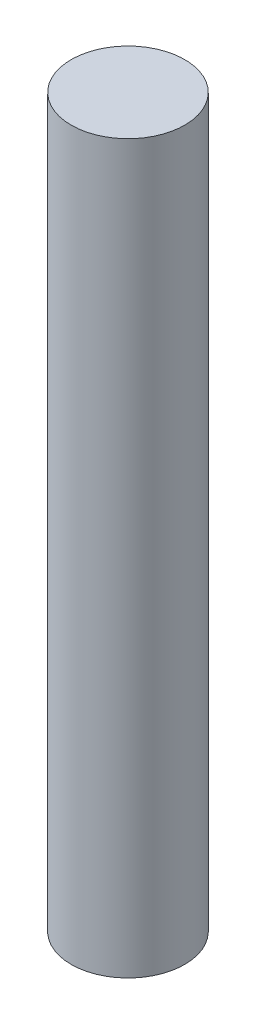
ISO-10303-21;
HEADER;
FILE_DESCRIPTION(('STEP AP214'),'2;1');
FILE_NAME('part.step','',(''),(''),'','','');
FILE_SCHEMA(('AUTOMOTIVE_DESIGN { 1 0 10303 214 1 1 1 1 }'));
ENDSEC;
DATA;
#1=APPLICATION_CONTEXT('core data for automotive mechanical design processes');
#2=APPLICATION_PROTOCOL_DEFINITION('international standard','automotive_design',2000,#1);
#3=PRODUCT_CONTEXT('',#1,'mechanical');
#4=PRODUCT('Part','Part','',(#3));
#5=PRODUCT_RELATED_PRODUCT_CATEGORY('part','',(#4));
#6=PRODUCT_DEFINITION_FORMATION('','',#4);
#7=PRODUCT_DEFINITION_CONTEXT('part definition',#1,'design');
#8=PRODUCT_DEFINITION('design','',#6,#7);
#9=PRODUCT_DEFINITION_SHAPE('','',#8);
#10=(LENGTH_UNIT() NAMED_UNIT(*) SI_UNIT(.MILLI.,.METRE.));
#11=(NAMED_UNIT(*) PLANE_ANGLE_UNIT() SI_UNIT($,.RADIAN.));
#12=(NAMED_UNIT(*) SI_UNIT($,.STERADIAN.) SOLID_ANGLE_UNIT());
#13=UNCERTAINTY_MEASURE_WITH_UNIT(LENGTH_MEASURE(1.E-05),#10,'distance_accuracy_value','');
#14=(GEOMETRIC_REPRESENTATION_CONTEXT(3) GLOBAL_UNCERTAINTY_ASSIGNED_CONTEXT((#13)) GLOBAL_UNIT_ASSIGNED_CONTEXT((#10,
#11,#12)) REPRESENTATION_CONTEXT('',''));
#15=CARTESIAN_POINT('',(0.,0.,0.));
#16=DIRECTION('',(0.,0.,1.));
#17=DIRECTION('',(1.,0.,0.));
#18=AXIS2_PLACEMENT_3D('',#15,#16,#17);
#19=CARTESIAN_POINT('',(0.,16.,0.));
#20=DIRECTION('',(0.,-1.,0.));
#21=DIRECTION('',(0.,0.,-1.));
#22=AXIS2_PLACEMENT_3D('',#19,#20,#21);
#23=CYLINDRICAL_SURFACE('',#22,1.25);
#24=CARTESIAN_POINT('',(0.,16.,0.));
#25=DIRECTION('',(0.,1.,0.));
#26=DIRECTION('',(0.,0.,1.));
#27=AXIS2_PLACEMENT_3D('',#24,#25,#26);
#28=CIRCLE('',#27,1.25);
#29=CARTESIAN_POINT('',(0.,16.,1.25));
#30=VERTEX_POINT('',#29);
#31=EDGE_CURVE('E10',#30,#30,#28,.T.);
#32=ORIENTED_EDGE('',*,*,#31,.F.);
#33=EDGE_LOOP('',(#32));
#34=FACE_BOUND('',#33,.T.);
#35=CARTESIAN_POINT('',(0.,0.,0.));
#36=DIRECTION('',(0.,1.,0.));
#37=DIRECTION('',(0.,0.,1.));
#38=AXIS2_PLACEMENT_3D('',#35,#36,#37);
#39=CIRCLE('',#38,1.25);
#40=CARTESIAN_POINT('',(0.,0.,1.25));
#41=VERTEX_POINT('',#40);
#42=EDGE_CURVE('E34',#41,#41,#39,.T.);
#43=ORIENTED_EDGE('',*,*,#42,.T.);
#44=EDGE_LOOP('',(#43));
#45=FACE_BOUND('',#44,.T.);
#46=ADVANCED_FACE('F31',(#34,#45),#23,.T.);
#47=CARTESIAN_POINT('',(0.,16.,0.));
#48=DIRECTION('',(0.,1.,0.));
#49=DIRECTION('',(0.,0.,1.));
#50=AXIS2_PLACEMENT_3D('',#47,#48,#49);
#51=PLANE('',#50);
#52=ORIENTED_EDGE('',*,*,#31,.T.);
#53=EDGE_LOOP('',(#52));
#54=FACE_BOUND('',#53,.T.);
#55=ADVANCED_FACE('F46',(#54),#51,.T.);
#56=CARTESIAN_POINT('',(0.,0.,0.));
#57=DIRECTION('',(0.,1.,0.));
#58=DIRECTION('',(0.,0.,1.));
#59=AXIS2_PLACEMENT_3D('',#56,#57,#58);
#60=PLANE('',#59);
#61=ORIENTED_EDGE('',*,*,#42,.F.);
#62=EDGE_LOOP('',(#61));
#63=FACE_BOUND('',#62,.T.);
#64=ADVANCED_FACE('F44',(#63),#60,.F.);
#65=CLOSED_SHELL('',(#46,#55,#64));
#66=MANIFOLD_SOLID_BREP('B2',#65);
#67=ADVANCED_BREP_SHAPE_REPRESENTATION('',(#18,#66),#14);
#68=SHAPE_DEFINITION_REPRESENTATION(#9,#67);
ENDSEC;
END-ISO-10303-21;
